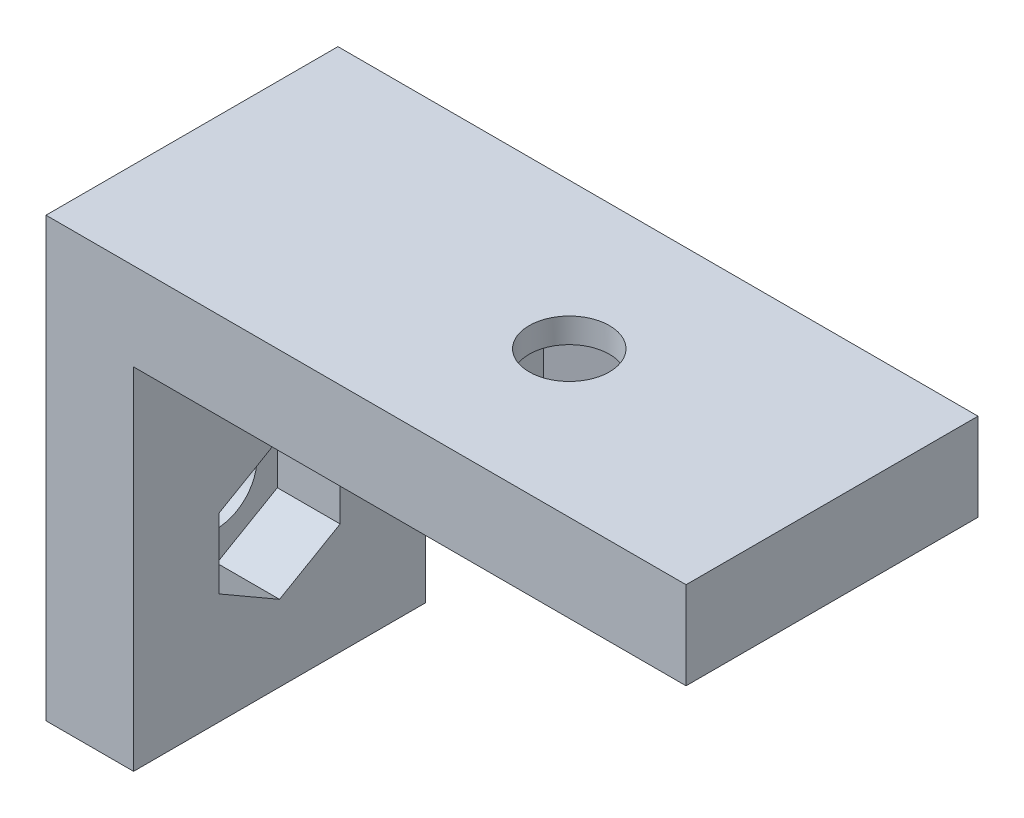
ISO-10303-21;
HEADER;
FILE_DESCRIPTION(('STEP AP214'),'2;1');
FILE_NAME('part.step','',(''),(''),'','','');
FILE_SCHEMA(('AUTOMOTIVE_DESIGN { 1 0 10303 214 1 1 1 1 }'));
ENDSEC;
DATA;
#1=APPLICATION_CONTEXT('core data for automotive mechanical design processes');
#2=APPLICATION_PROTOCOL_DEFINITION('international standard','automotive_design',2000,#1);
#3=PRODUCT_CONTEXT('',#1,'mechanical');
#4=PRODUCT('Part','Part','',(#3));
#5=PRODUCT_RELATED_PRODUCT_CATEGORY('part','',(#4));
#6=PRODUCT_DEFINITION_FORMATION('','',#4);
#7=PRODUCT_DEFINITION_CONTEXT('part definition',#1,'design');
#8=PRODUCT_DEFINITION('design','',#6,#7);
#9=PRODUCT_DEFINITION_SHAPE('','',#8);
#10=(LENGTH_UNIT() NAMED_UNIT(*) SI_UNIT(.MILLI.,.METRE.));
#11=(NAMED_UNIT(*) PLANE_ANGLE_UNIT() SI_UNIT($,.RADIAN.));
#12=(NAMED_UNIT(*) SI_UNIT($,.STERADIAN.) SOLID_ANGLE_UNIT());
#13=UNCERTAINTY_MEASURE_WITH_UNIT(LENGTH_MEASURE(1.E-05),#10,'distance_accuracy_value','');
#14=(GEOMETRIC_REPRESENTATION_CONTEXT(3) GLOBAL_UNCERTAINTY_ASSIGNED_CONTEXT((#13)) GLOBAL_UNIT_ASSIGNED_CONTEXT((#10,
#11,#12)) REPRESENTATION_CONTEXT('',''));
#15=CARTESIAN_POINT('',(0.,0.,0.));
#16=DIRECTION('',(0.,0.,1.));
#17=DIRECTION('',(1.,0.,0.));
#18=AXIS2_PLACEMENT_3D('',#15,#16,#17);
#19=CARTESIAN_POINT('',(6.15,-20.,10.));
#20=DIRECTION('',(-1.,0.,0.));
#21=DIRECTION('',(0.,0.,1.));
#22=AXIS2_PLACEMENT_3D('',#19,#20,#21);
#23=CYLINDRICAL_SURFACE('',#22,2.75);
#24=CARTESIAN_POINT('',(6.15,-20.,10.));
#25=DIRECTION('',(1.,0.,0.));
#26=DIRECTION('',(0.,0.,-1.));
#27=AXIS2_PLACEMENT_3D('',#24,#25,#26);
#28=CIRCLE('',#27,2.75);
#29=CARTESIAN_POINT('',(6.15,-20.,7.25));
#30=VERTEX_POINT('',#29);
#31=EDGE_CURVE('E222',#30,#30,#28,.F.);
#32=ORIENTED_EDGE('',*,*,#31,.T.);
#33=EDGE_LOOP('',(#32));
#34=FACE_BOUND('',#33,.T.);
#35=CARTESIAN_POINT('',(7.85,-20.,10.));
#36=DIRECTION('',(1.,0.,0.));
#37=DIRECTION('',(0.,0.,-1.));
#38=AXIS2_PLACEMENT_3D('',#35,#36,#37);
#39=CIRCLE('',#38,2.75);
#40=CARTESIAN_POINT('',(7.85,-20.,7.25));
#41=VERTEX_POINT('',#40);
#42=EDGE_CURVE('E45',#41,#41,#39,.T.);
#43=ORIENTED_EDGE('',*,*,#42,.T.);
#44=EDGE_LOOP('',(#43));
#45=FACE_BOUND('',#44,.T.);
#46=ADVANCED_FACE('F41',(#34,#45),#23,.F.);
#47=CARTESIAN_POINT('',(6.15,0.,20.));
#48=DIRECTION('',(1.,0.,0.));
#49=DIRECTION('',(0.,0.,-1.));
#50=AXIS2_PLACEMENT_3D('',#47,#48,#49);
#51=PLANE('',#50);
#52=ORIENTED_EDGE('',*,*,#31,.F.);
#53=EDGE_LOOP('',(#52));
#54=FACE_BOUND('',#53,.T.);
#55=DIRECTION('',(0.,-1.,0.));
#56=VECTOR('',#55,1.);
#57=CARTESIAN_POINT('',(6.15,0.,0.));
#58=LINE('',#57,#56);
#59=CARTESIAN_POINT('',(6.15,0.,0.));
#60=VERTEX_POINT('',#59);
#61=CARTESIAN_POINT('',(6.15,-30.,0.));
#62=VERTEX_POINT('',#61);
#63=EDGE_CURVE('E287',#60,#62,#58,.T.);
#64=ORIENTED_EDGE('',*,*,#63,.T.);
#65=DIRECTION('',(0.,0.,-1.));
#66=VECTOR('',#65,1.);
#67=CARTESIAN_POINT('',(6.15,-30.,20.));
#68=LINE('',#67,#66);
#69=CARTESIAN_POINT('',(6.15,-30.,20.));
#70=VERTEX_POINT('',#69);
#71=EDGE_CURVE('E11',#70,#62,#68,.T.);
#72=ORIENTED_EDGE('',*,*,#71,.F.);
#73=DIRECTION('',(0.,-1.,0.));
#74=VECTOR('',#73,1.);
#75=CARTESIAN_POINT('',(6.15,0.,20.));
#76=LINE('',#75,#74);
#77=CARTESIAN_POINT('',(6.15,0.,20.));
#78=VERTEX_POINT('',#77);
#79=EDGE_CURVE('E272',#78,#70,#76,.T.);
#80=ORIENTED_EDGE('',*,*,#79,.F.);
#81=DIRECTION('',(0.,0.,-1.));
#82=VECTOR('',#81,1.);
#83=CARTESIAN_POINT('',(6.15,0.,20.));
#84=LINE('',#83,#82);
#85=EDGE_CURVE('E286',#78,#60,#84,.T.);
#86=ORIENTED_EDGE('',*,*,#85,.T.);
#87=EDGE_LOOP('',(#64,#72,#80,#86));
#88=FACE_BOUND('',#87,.T.);
#89=ADVANCED_FACE('F43',(#54,#88),#51,.F.);
#90=CARTESIAN_POINT('',(6.15,-30.,20.));
#91=DIRECTION('',(0.,1.,0.));
#92=DIRECTION('',(0.,0.,1.));
#93=AXIS2_PLACEMENT_3D('',#90,#91,#92);
#94=PLANE('',#93);
#95=DIRECTION('',(1.,0.,0.));
#96=VECTOR('',#95,1.);
#97=CARTESIAN_POINT('',(6.15,-30.,0.));
#98=LINE('',#97,#96);
#99=CARTESIAN_POINT('',(12.15,-30.,0.));
#100=VERTEX_POINT('',#99);
#101=EDGE_CURVE('E290',#62,#100,#98,.T.);
#102=ORIENTED_EDGE('',*,*,#101,.T.);
#103=DIRECTION('',(0.,0.,-1.));
#104=VECTOR('',#103,1.);
#105=CARTESIAN_POINT('',(12.15,-30.,20.));
#106=LINE('',#105,#104);
#107=CARTESIAN_POINT('',(12.15,-30.,20.));
#108=VERTEX_POINT('',#107);
#109=EDGE_CURVE('E50',#108,#100,#106,.T.);
#110=ORIENTED_EDGE('',*,*,#109,.F.);
#111=DIRECTION('',(1.,0.,0.));
#112=VECTOR('',#111,1.);
#113=CARTESIAN_POINT('',(6.15,-30.,20.));
#114=LINE('',#113,#112);
#115=EDGE_CURVE('E275',#70,#108,#114,.T.);
#116=ORIENTED_EDGE('',*,*,#115,.F.);
#117=ORIENTED_EDGE('',*,*,#71,.T.);
#118=EDGE_LOOP('',(#102,#110,#116,#117));
#119=FACE_BOUND('',#118,.T.);
#120=ADVANCED_FACE('F341',(#119),#94,.F.);
#121=CARTESIAN_POINT('',(12.15,-30.,20.));
#122=DIRECTION('',(-1.,0.,0.));
#123=DIRECTION('',(0.,0.,1.));
#124=AXIS2_PLACEMENT_3D('',#121,#122,#123);
#125=PLANE('',#124);
#126=DIRECTION('',(0.,-0.5,0.866025403784438));
#127=VECTOR('',#126,1.);
#128=CARTESIAN_POINT('',(12.15,-15.2079927657261,10.));
#129=LINE('',#128,#127);
#130=CARTESIAN_POINT('',(12.15,-15.2079927657261,10.));
#131=VERTEX_POINT('',#130);
#132=CARTESIAN_POINT('',(12.15,-17.6039963828631,14.15));
#133=VERTEX_POINT('',#132);
#134=EDGE_CURVE('E203',#131,#133,#129,.T.);
#135=ORIENTED_EDGE('',*,*,#134,.F.);
#136=DIRECTION('',(0.,0.5,0.866025403784438));
#137=VECTOR('',#136,1.);
#138=CARTESIAN_POINT('',(12.15,-17.6039963828631,5.85));
#139=LINE('',#138,#137);
#140=CARTESIAN_POINT('',(12.15,-17.6039963828631,5.85));
#141=VERTEX_POINT('',#140);
#142=EDGE_CURVE('E58',#141,#131,#139,.T.);
#143=ORIENTED_EDGE('',*,*,#142,.F.);
#144=DIRECTION('',(0.,1.,0.));
#145=VECTOR('',#144,1.);
#146=CARTESIAN_POINT('',(12.15,-22.396003617137,5.85));
#147=LINE('',#146,#145);
#148=CARTESIAN_POINT('',(12.15,-22.396003617137,5.85));
#149=VERTEX_POINT('',#148);
#150=EDGE_CURVE('E189',#149,#141,#147,.T.);
#151=ORIENTED_EDGE('',*,*,#150,.F.);
#152=DIRECTION('',(0.,0.5,-0.866025403784439));
#153=VECTOR('',#152,1.);
#154=CARTESIAN_POINT('',(12.15,-24.7920072342739,10.));
#155=LINE('',#154,#153);
#156=CARTESIAN_POINT('',(12.15,-24.7920072342739,10.));
#157=VERTEX_POINT('',#156);
#158=EDGE_CURVE('E192',#157,#149,#155,.T.);
#159=ORIENTED_EDGE('',*,*,#158,.F.);
#160=DIRECTION('',(0.,-0.5,-0.866025403784438));
#161=VECTOR('',#160,1.);
#162=CARTESIAN_POINT('',(12.15,-22.3960036171369,14.15));
#163=LINE('',#162,#161);
#164=CARTESIAN_POINT('',(12.15,-22.3960036171369,14.15));
#165=VERTEX_POINT('',#164);
#166=EDGE_CURVE('E208',#165,#157,#163,.T.);
#167=ORIENTED_EDGE('',*,*,#166,.F.);
#168=DIRECTION('',(0.,-1.,0.));
#169=VECTOR('',#168,1.);
#170=CARTESIAN_POINT('',(12.15,-17.6039963828631,14.15));
#171=LINE('',#170,#169);
#172=EDGE_CURVE('E205',#133,#165,#171,.T.);
#173=ORIENTED_EDGE('',*,*,#172,.F.);
#174=EDGE_LOOP('',(#135,#143,#151,#159,#167,#173));
#175=FACE_BOUND('',#174,.T.);
#176=DIRECTION('',(0.,1.,0.));
#177=VECTOR('',#176,1.);
#178=CARTESIAN_POINT('',(12.15,-30.,0.));
#179=LINE('',#178,#177);
#180=CARTESIAN_POINT('',(12.15,-6.,0.));
#181=VERTEX_POINT('',#180);
#182=EDGE_CURVE('E293',#100,#181,#179,.T.);
#183=ORIENTED_EDGE('',*,*,#182,.T.);
#184=DIRECTION('',(0.,0.,-1.));
#185=VECTOR('',#184,1.);
#186=CARTESIAN_POINT('',(12.15,-6.,20.));
#187=LINE('',#186,#185);
#188=CARTESIAN_POINT('',(12.15,-6.,20.));
#189=VERTEX_POINT('',#188);
#190=EDGE_CURVE('E308',#189,#181,#187,.T.);
#191=ORIENTED_EDGE('',*,*,#190,.F.);
#192=DIRECTION('',(0.,1.,0.));
#193=VECTOR('',#192,1.);
#194=CARTESIAN_POINT('',(12.15,-30.,20.));
#195=LINE('',#194,#193);
#196=EDGE_CURVE('E278',#108,#189,#195,.T.);
#197=ORIENTED_EDGE('',*,*,#196,.F.);
#198=ORIENTED_EDGE('',*,*,#109,.T.);
#199=EDGE_LOOP('',(#183,#191,#197,#198));
#200=FACE_BOUND('',#199,.T.);
#201=ADVANCED_FACE('F406',(#175,#200),#125,.F.);
#202=CARTESIAN_POINT('',(12.15,-6.,20.));
#203=DIRECTION('',(0.,1.,0.));
#204=DIRECTION('',(0.,0.,1.));
#205=AXIS2_PLACEMENT_3D('',#202,#203,#204);
#206=PLANE('',#205);
#207=DIRECTION('',(0.,0.,-1.));
#208=VECTOR('',#207,1.);
#209=CARTESIAN_POINT('',(27.85,-6.,7.60399638286305));
#210=LINE('',#209,#208);
#211=CARTESIAN_POINT('',(27.85,-6.,12.3960036171369));
#212=VERTEX_POINT('',#211);
#213=CARTESIAN_POINT('',(27.85,-6.,7.60399638286305));
#214=VERTEX_POINT('',#213);
#215=EDGE_CURVE('E246',#212,#214,#210,.T.);
#216=ORIENTED_EDGE('',*,*,#215,.F.);
#217=DIRECTION('',(-0.866025403784439,0.,-0.5));
#218=VECTOR('',#217,1.);
#219=CARTESIAN_POINT('',(27.85,-6.,12.3960036171369));
#220=LINE('',#219,#218);
#221=CARTESIAN_POINT('',(32.,-6.,14.7920072342739));
#222=VERTEX_POINT('',#221);
#223=EDGE_CURVE('E66',#222,#212,#220,.T.);
#224=ORIENTED_EDGE('',*,*,#223,.F.);
#225=DIRECTION('',(-0.866025403784439,0.,0.5));
#226=VECTOR('',#225,1.);
#227=CARTESIAN_POINT('',(32.,-6.,14.7920072342739));
#228=LINE('',#227,#226);
#229=CARTESIAN_POINT('',(36.15,-6.,12.3960036171369));
#230=VERTEX_POINT('',#229);
#231=EDGE_CURVE('E229',#230,#222,#228,.T.);
#232=ORIENTED_EDGE('',*,*,#231,.F.);
#233=DIRECTION('',(0.,0.,1.));
#234=VECTOR('',#233,1.);
#235=CARTESIAN_POINT('',(36.15,-6.,12.3960036171369));
#236=LINE('',#235,#234);
#237=CARTESIAN_POINT('',(36.15,-6.,7.60399638286305));
#238=VERTEX_POINT('',#237);
#239=EDGE_CURVE('E255',#238,#230,#236,.T.);
#240=ORIENTED_EDGE('',*,*,#239,.F.);
#241=DIRECTION('',(0.866025403784439,0.,0.5));
#242=VECTOR('',#241,1.);
#243=CARTESIAN_POINT('',(36.15,-6.,7.60399638286305));
#244=LINE('',#243,#242);
#245=CARTESIAN_POINT('',(32.,-6.,5.20799276572611));
#246=VERTEX_POINT('',#245);
#247=EDGE_CURVE('E252',#246,#238,#244,.T.);
#248=ORIENTED_EDGE('',*,*,#247,.F.);
#249=DIRECTION('',(0.866025403784439,0.,-0.5));
#250=VECTOR('',#249,1.);
#251=CARTESIAN_POINT('',(32.,-6.,5.20799276572611));
#252=LINE('',#251,#250);
#253=EDGE_CURVE('E249',#214,#246,#252,.T.);
#254=ORIENTED_EDGE('',*,*,#253,.F.);
#255=EDGE_LOOP('',(#216,#224,#232,#240,#248,#254));
#256=FACE_BOUND('',#255,.T.);
#257=DIRECTION('',(1.,0.,0.));
#258=VECTOR('',#257,1.);
#259=CARTESIAN_POINT('',(12.15,-6.,0.));
#260=LINE('',#259,#258);
#261=CARTESIAN_POINT('',(50.,-6.,0.));
#262=VERTEX_POINT('',#261);
#263=EDGE_CURVE('E295',#181,#262,#260,.T.);
#264=ORIENTED_EDGE('',*,*,#263,.T.);
#265=DIRECTION('',(0.,0.,-1.));
#266=VECTOR('',#265,1.);
#267=CARTESIAN_POINT('',(50.,-6.,20.));
#268=LINE('',#267,#266);
#269=CARTESIAN_POINT('',(50.,-6.,20.));
#270=VERTEX_POINT('',#269);
#271=EDGE_CURVE('E305',#270,#262,#268,.T.);
#272=ORIENTED_EDGE('',*,*,#271,.F.);
#273=DIRECTION('',(1.,0.,0.));
#274=VECTOR('',#273,1.);
#275=CARTESIAN_POINT('',(12.15,-6.,20.));
#276=LINE('',#275,#274);
#277=EDGE_CURVE('E280',#189,#270,#276,.T.);
#278=ORIENTED_EDGE('',*,*,#277,.F.);
#279=ORIENTED_EDGE('',*,*,#190,.T.);
#280=EDGE_LOOP('',(#264,#272,#278,#279));
#281=FACE_BOUND('',#280,.T.);
#282=ADVANCED_FACE('F409',(#256,#281),#206,.F.);
#283=CARTESIAN_POINT('',(50.,-6.,20.));
#284=DIRECTION('',(-1.,0.,0.));
#285=DIRECTION('',(0.,0.,1.));
#286=AXIS2_PLACEMENT_3D('',#283,#284,#285);
#287=PLANE('',#286);
#288=DIRECTION('',(0.,1.,0.));
#289=VECTOR('',#288,1.);
#290=CARTESIAN_POINT('',(50.,-6.,0.));
#291=LINE('',#290,#289);
#292=CARTESIAN_POINT('',(50.,0.,0.));
#293=VERTEX_POINT('',#292);
#294=EDGE_CURVE('E297',#262,#293,#291,.T.);
#295=ORIENTED_EDGE('',*,*,#294,.T.);
#296=DIRECTION('',(0.,0.,-1.));
#297=VECTOR('',#296,1.);
#298=CARTESIAN_POINT('',(50.,0.,20.));
#299=LINE('',#298,#297);
#300=CARTESIAN_POINT('',(50.,0.,20.));
#301=VERTEX_POINT('',#300);
#302=EDGE_CURVE('E302',#301,#293,#299,.T.);
#303=ORIENTED_EDGE('',*,*,#302,.F.);
#304=DIRECTION('',(0.,1.,0.));
#305=VECTOR('',#304,1.);
#306=CARTESIAN_POINT('',(50.,-6.,20.));
#307=LINE('',#306,#305);
#308=EDGE_CURVE('E282',#270,#301,#307,.T.);
#309=ORIENTED_EDGE('',*,*,#308,.F.);
#310=ORIENTED_EDGE('',*,*,#271,.T.);
#311=EDGE_LOOP('',(#295,#303,#309,#310));
#312=FACE_BOUND('',#311,.T.);
#313=ADVANCED_FACE('F428',(#312),#287,.F.);
#314=CARTESIAN_POINT('',(50.,0.,20.));
#315=DIRECTION('',(0.,-1.,0.));
#316=DIRECTION('',(0.,0.,-1.));
#317=AXIS2_PLACEMENT_3D('',#314,#315,#316);
#318=PLANE('',#317);
#319=CARTESIAN_POINT('',(32.,0.,10.));
#320=DIRECTION('',(0.,-1.,0.));
#321=DIRECTION('',(0.,0.,-1.));
#322=AXIS2_PLACEMENT_3D('',#319,#320,#321);
#323=CIRCLE('',#322,2.75);
#324=CARTESIAN_POINT('',(32.,0.,7.25));
#325=VERTEX_POINT('',#324);
#326=EDGE_CURVE('E291',#325,#325,#323,.T.);
#327=ORIENTED_EDGE('',*,*,#326,.T.);
#328=EDGE_LOOP('',(#327));
#329=FACE_BOUND('',#328,.T.);
#330=DIRECTION('',(-1.,0.,0.));
#331=VECTOR('',#330,1.);
#332=CARTESIAN_POINT('',(50.,0.,0.));
#333=LINE('',#332,#331);
#334=EDGE_CURVE('E276',#293,#60,#333,.T.);
#335=ORIENTED_EDGE('',*,*,#334,.T.);
#336=ORIENTED_EDGE('',*,*,#85,.F.);
#337=DIRECTION('',(-1.,0.,0.));
#338=VECTOR('',#337,1.);
#339=CARTESIAN_POINT('',(50.,0.,20.));
#340=LINE('',#339,#338);
#341=EDGE_CURVE('E284',#301,#78,#340,.T.);
#342=ORIENTED_EDGE('',*,*,#341,.F.);
#343=ORIENTED_EDGE('',*,*,#302,.T.);
#344=EDGE_LOOP('',(#335,#336,#342,#343));
#345=FACE_BOUND('',#344,.T.);
#346=ADVANCED_FACE('F439',(#329,#345),#318,.F.);
#347=CARTESIAN_POINT('',(0.,0.,20.));
#348=DIRECTION('',(0.,0.,1.));
#349=DIRECTION('',(1.,0.,0.));
#350=AXIS2_PLACEMENT_3D('',#347,#348,#349);
#351=PLANE('',#350);
#352=ORIENTED_EDGE('',*,*,#79,.T.);
#353=ORIENTED_EDGE('',*,*,#115,.T.);
#354=ORIENTED_EDGE('',*,*,#196,.T.);
#355=ORIENTED_EDGE('',*,*,#277,.T.);
#356=ORIENTED_EDGE('',*,*,#308,.T.);
#357=ORIENTED_EDGE('',*,*,#341,.T.);
#358=EDGE_LOOP('',(#352,#353,#354,#355,#356,#357));
#359=FACE_BOUND('',#358,.T.);
#360=ADVANCED_FACE('F449',(#359),#351,.T.);
#361=CARTESIAN_POINT('',(0.,0.,0.));
#362=DIRECTION('',(0.,0.,1.));
#363=DIRECTION('',(1.,0.,0.));
#364=AXIS2_PLACEMENT_3D('',#361,#362,#363);
#365=PLANE('',#364);
#366=ORIENTED_EDGE('',*,*,#63,.F.);
#367=ORIENTED_EDGE('',*,*,#334,.F.);
#368=ORIENTED_EDGE('',*,*,#294,.F.);
#369=ORIENTED_EDGE('',*,*,#263,.F.);
#370=ORIENTED_EDGE('',*,*,#182,.F.);
#371=ORIENTED_EDGE('',*,*,#101,.F.);
#372=EDGE_LOOP('',(#366,#367,#368,#369,#370,#371));
#373=FACE_BOUND('',#372,.T.);
#374=ADVANCED_FACE('F331',(#373),#365,.F.);
#375=CARTESIAN_POINT('',(32.,-30.,10.));
#376=DIRECTION('',(0.,1.,0.));
#377=DIRECTION('',(0.,0.,1.));
#378=AXIS2_PLACEMENT_3D('',#375,#376,#377);
#379=CYLINDRICAL_SURFACE('',#378,2.75);
#380=CARTESIAN_POINT('',(32.,-1.7,10.));
#381=DIRECTION('',(0.,1.,0.));
#382=DIRECTION('',(0.,0.,1.));
#383=AXIS2_PLACEMENT_3D('',#380,#381,#382);
#384=CIRCLE('',#383,2.75);
#385=CARTESIAN_POINT('',(32.,-1.7,12.75));
#386=VERTEX_POINT('',#385);
#387=EDGE_CURVE('E262',#386,#386,#384,.F.);
#388=ORIENTED_EDGE('',*,*,#387,.T.);
#389=EDGE_LOOP('',(#388));
#390=FACE_BOUND('',#389,.T.);
#391=ORIENTED_EDGE('',*,*,#326,.F.);
#392=EDGE_LOOP('',(#391));
#393=FACE_BOUND('',#392,.T.);
#394=ADVANCED_FACE('F317',(#390,#393),#379,.F.);
#395=CARTESIAN_POINT('',(0.,-1.7,0.));
#396=DIRECTION('',(0.,1.,0.));
#397=DIRECTION('',(0.,0.,1.));
#398=AXIS2_PLACEMENT_3D('',#395,#396,#397);
#399=PLANE('',#398);
#400=DIRECTION('',(-0.866025403784439,0.,-0.5));
#401=VECTOR('',#400,1.);
#402=CARTESIAN_POINT('',(27.85,-1.7,12.3960036171369));
#403=LINE('',#402,#401);
#404=CARTESIAN_POINT('',(32.,-1.7,14.7920072342739));
#405=VERTEX_POINT('',#404);
#406=CARTESIAN_POINT('',(27.85,-1.7,12.3960036171369));
#407=VERTEX_POINT('',#406);
#408=EDGE_CURVE('E225',#405,#407,#403,.T.);
#409=ORIENTED_EDGE('',*,*,#408,.T.);
#410=DIRECTION('',(0.,0.,-1.));
#411=VECTOR('',#410,1.);
#412=CARTESIAN_POINT('',(27.85,-1.7,7.60399638286305));
#413=LINE('',#412,#411);
#414=CARTESIAN_POINT('',(27.85,-1.7,7.60399638286305));
#415=VERTEX_POINT('',#414);
#416=EDGE_CURVE('E228',#407,#415,#413,.T.);
#417=ORIENTED_EDGE('',*,*,#416,.T.);
#418=DIRECTION('',(0.866025403784439,0.,-0.5));
#419=VECTOR('',#418,1.);
#420=CARTESIAN_POINT('',(32.,-1.7,5.20799276572611));
#421=LINE('',#420,#419);
#422=CARTESIAN_POINT('',(32.,-1.7,5.20799276572611));
#423=VERTEX_POINT('',#422);
#424=EDGE_CURVE('E232',#415,#423,#421,.T.);
#425=ORIENTED_EDGE('',*,*,#424,.T.);
#426=DIRECTION('',(0.866025403784439,0.,0.5));
#427=VECTOR('',#426,1.);
#428=CARTESIAN_POINT('',(36.15,-1.7,7.60399638286305));
#429=LINE('',#428,#427);
#430=CARTESIAN_POINT('',(36.15,-1.7,7.60399638286305));
#431=VERTEX_POINT('',#430);
#432=EDGE_CURVE('E235',#423,#431,#429,.T.);
#433=ORIENTED_EDGE('',*,*,#432,.T.);
#434=DIRECTION('',(0.,0.,1.));
#435=VECTOR('',#434,1.);
#436=CARTESIAN_POINT('',(36.15,-1.7,12.3960036171369));
#437=LINE('',#436,#435);
#438=CARTESIAN_POINT('',(36.15,-1.7,12.3960036171369));
#439=VERTEX_POINT('',#438);
#440=EDGE_CURVE('E238',#431,#439,#437,.T.);
#441=ORIENTED_EDGE('',*,*,#440,.T.);
#442=DIRECTION('',(-0.866025403784439,0.,0.5));
#443=VECTOR('',#442,1.);
#444=CARTESIAN_POINT('',(32.,-1.7,14.7920072342739));
#445=LINE('',#444,#443);
#446=EDGE_CURVE('E241',#439,#405,#445,.T.);
#447=ORIENTED_EDGE('',*,*,#446,.T.);
#448=EDGE_LOOP('',(#409,#417,#425,#433,#441,#447));
#449=FACE_BOUND('',#448,.T.);
#450=ORIENTED_EDGE('',*,*,#387,.F.);
#451=EDGE_LOOP('',(#450));
#452=FACE_BOUND('',#451,.T.);
#453=ADVANCED_FACE('F320',(#449,#452),#399,.F.);
#454=CARTESIAN_POINT('',(27.85,-1.7,12.3960036171369));
#455=DIRECTION('',(-0.5,0.,0.866025403784439));
#456=DIRECTION('',(0.866025403784439,0.,0.5));
#457=AXIS2_PLACEMENT_3D('',#454,#455,#456);
#458=PLANE('',#457);
#459=ORIENTED_EDGE('',*,*,#223,.T.);
#460=DIRECTION('',(0.,-1.,0.));
#461=VECTOR('',#460,1.);
#462=CARTESIAN_POINT('',(27.85,-1.7,12.3960036171369));
#463=LINE('',#462,#461);
#464=EDGE_CURVE('E244',#407,#212,#463,.T.);
#465=ORIENTED_EDGE('',*,*,#464,.F.);
#466=ORIENTED_EDGE('',*,*,#408,.F.);
#467=DIRECTION('',(0.,-1.,0.));
#468=VECTOR('',#467,1.);
#469=CARTESIAN_POINT('',(32.,-1.7,14.7920072342739));
#470=LINE('',#469,#468);
#471=EDGE_CURVE('E260',#405,#222,#470,.T.);
#472=ORIENTED_EDGE('',*,*,#471,.T.);
#473=EDGE_LOOP('',(#459,#465,#466,#472));
#474=FACE_BOUND('',#473,.T.);
#475=ADVANCED_FACE('F322',(#474),#458,.F.);
#476=CARTESIAN_POINT('',(32.,-1.7,14.7920072342739));
#477=DIRECTION('',(0.5,0.,0.866025403784439));
#478=DIRECTION('',(0.866025403784439,0.,-0.5));
#479=AXIS2_PLACEMENT_3D('',#476,#477,#478);
#480=PLANE('',#479);
#481=ORIENTED_EDGE('',*,*,#231,.T.);
#482=ORIENTED_EDGE('',*,*,#471,.F.);
#483=ORIENTED_EDGE('',*,*,#446,.F.);
#484=DIRECTION('',(0.,-1.,0.));
#485=VECTOR('',#484,1.);
#486=CARTESIAN_POINT('',(36.15,-1.7,12.3960036171369));
#487=LINE('',#486,#485);
#488=EDGE_CURVE('E263',#439,#230,#487,.T.);
#489=ORIENTED_EDGE('',*,*,#488,.T.);
#490=EDGE_LOOP('',(#481,#482,#483,#489));
#491=FACE_BOUND('',#490,.T.);
#492=ADVANCED_FACE('F329',(#491),#480,.F.);
#493=CARTESIAN_POINT('',(36.15,-1.7,12.3960036171369));
#494=DIRECTION('',(1.,0.,0.));
#495=DIRECTION('',(0.,0.,-1.));
#496=AXIS2_PLACEMENT_3D('',#493,#494,#495);
#497=PLANE('',#496);
#498=ORIENTED_EDGE('',*,*,#239,.T.);
#499=ORIENTED_EDGE('',*,*,#488,.F.);
#500=ORIENTED_EDGE('',*,*,#440,.F.);
#501=DIRECTION('',(0.,-1.,0.));
#502=VECTOR('',#501,1.);
#503=CARTESIAN_POINT('',(36.15,-1.7,7.60399638286305));
#504=LINE('',#503,#502);
#505=EDGE_CURVE('E265',#431,#238,#504,.T.);
#506=ORIENTED_EDGE('',*,*,#505,.T.);
#507=EDGE_LOOP('',(#498,#499,#500,#506));
#508=FACE_BOUND('',#507,.T.);
#509=ADVANCED_FACE('F492',(#508),#497,.F.);
#510=CARTESIAN_POINT('',(36.15,-1.7,7.60399638286305));
#511=DIRECTION('',(0.5,0.,-0.866025403784439));
#512=DIRECTION('',(-0.866025403784439,0.,-0.5));
#513=AXIS2_PLACEMENT_3D('',#510,#511,#512);
#514=PLANE('',#513);
#515=ORIENTED_EDGE('',*,*,#247,.T.);
#516=ORIENTED_EDGE('',*,*,#505,.F.);
#517=ORIENTED_EDGE('',*,*,#432,.F.);
#518=DIRECTION('',(0.,-1.,0.));
#519=VECTOR('',#518,1.);
#520=CARTESIAN_POINT('',(32.,-1.7,5.20799276572611));
#521=LINE('',#520,#519);
#522=EDGE_CURVE('E267',#423,#246,#521,.T.);
#523=ORIENTED_EDGE('',*,*,#522,.T.);
#524=EDGE_LOOP('',(#515,#516,#517,#523));
#525=FACE_BOUND('',#524,.T.);
#526=ADVANCED_FACE('F501',(#525),#514,.F.);
#527=CARTESIAN_POINT('',(32.,-1.7,5.20799276572611));
#528=DIRECTION('',(-0.5,0.,-0.866025403784439));
#529=DIRECTION('',(-0.866025403784439,0.,0.5));
#530=AXIS2_PLACEMENT_3D('',#527,#528,#529);
#531=PLANE('',#530);
#532=ORIENTED_EDGE('',*,*,#253,.T.);
#533=ORIENTED_EDGE('',*,*,#522,.F.);
#534=ORIENTED_EDGE('',*,*,#424,.F.);
#535=DIRECTION('',(0.,-1.,0.));
#536=VECTOR('',#535,1.);
#537=CARTESIAN_POINT('',(27.85,-1.7,7.60399638286305));
#538=LINE('',#537,#536);
#539=EDGE_CURVE('E269',#415,#214,#538,.T.);
#540=ORIENTED_EDGE('',*,*,#539,.T.);
#541=EDGE_LOOP('',(#532,#533,#534,#540));
#542=FACE_BOUND('',#541,.T.);
#543=ADVANCED_FACE('F511',(#542),#531,.F.);
#544=CARTESIAN_POINT('',(27.85,-1.7,7.60399638286305));
#545=DIRECTION('',(-1.,0.,0.));
#546=DIRECTION('',(0.,0.,1.));
#547=AXIS2_PLACEMENT_3D('',#544,#545,#546);
#548=PLANE('',#547);
#549=ORIENTED_EDGE('',*,*,#215,.T.);
#550=ORIENTED_EDGE('',*,*,#539,.F.);
#551=ORIENTED_EDGE('',*,*,#416,.F.);
#552=ORIENTED_EDGE('',*,*,#464,.T.);
#553=EDGE_LOOP('',(#549,#550,#551,#552));
#554=FACE_BOUND('',#553,.T.);
#555=ADVANCED_FACE('F348',(#554),#548,.F.);
#556=CARTESIAN_POINT('',(7.85,-17.6039963828631,5.85));
#557=DIRECTION('',(0.,0.866025403784439,-0.5));
#558=DIRECTION('',(0.,0.5,0.866025403784439));
#559=AXIS2_PLACEMENT_3D('',#556,#557,#558);
#560=PLANE('',#559);
#561=ORIENTED_EDGE('',*,*,#142,.T.);
#562=DIRECTION('',(1.,0.,0.));
#563=VECTOR('',#562,1.);
#564=CARTESIAN_POINT('',(7.85,-15.2079927657261,10.));
#565=LINE('',#564,#563);
#566=CARTESIAN_POINT('',(7.85,-15.2079927657261,10.));
#567=VERTEX_POINT('',#566);
#568=EDGE_CURVE('E166',#567,#131,#565,.T.);
#569=ORIENTED_EDGE('',*,*,#568,.F.);
#570=DIRECTION('',(0.,0.5,0.866025403784438));
#571=VECTOR('',#570,1.);
#572=CARTESIAN_POINT('',(7.85,-17.6039963828631,5.85));
#573=LINE('',#572,#571);
#574=CARTESIAN_POINT('',(7.85,-17.6039963828631,5.85));
#575=VERTEX_POINT('',#574);
#576=EDGE_CURVE('E170',#575,#567,#573,.T.);
#577=ORIENTED_EDGE('',*,*,#576,.F.);
#578=DIRECTION('',(1.,0.,0.));
#579=VECTOR('',#578,1.);
#580=CARTESIAN_POINT('',(7.85,-17.6039963828631,5.85));
#581=LINE('',#580,#579);
#582=EDGE_CURVE('E213',#575,#141,#581,.T.);
#583=ORIENTED_EDGE('',*,*,#582,.T.);
#584=EDGE_LOOP('',(#561,#569,#577,#583));
#585=FACE_BOUND('',#584,.T.);
#586=ADVANCED_FACE('F168',(#585),#560,.F.);
#587=CARTESIAN_POINT('',(7.85,-22.396003617137,5.85));
#588=DIRECTION('',(0.,0.,-1.));
#589=DIRECTION('',(0.,1.,0.));
#590=AXIS2_PLACEMENT_3D('',#587,#588,#589);
#591=PLANE('',#590);
#592=ORIENTED_EDGE('',*,*,#150,.T.);
#593=ORIENTED_EDGE('',*,*,#582,.F.);
#594=DIRECTION('',(0.,1.,0.));
#595=VECTOR('',#594,1.);
#596=CARTESIAN_POINT('',(7.85,-22.396003617137,5.85));
#597=LINE('',#596,#595);
#598=CARTESIAN_POINT('',(7.85,-22.396003617137,5.85));
#599=VERTEX_POINT('',#598);
#600=EDGE_CURVE('E176',#599,#575,#597,.T.);
#601=ORIENTED_EDGE('',*,*,#600,.F.);
#602=DIRECTION('',(1.,0.,0.));
#603=VECTOR('',#602,1.);
#604=CARTESIAN_POINT('',(7.85,-22.396003617137,5.85));
#605=LINE('',#604,#603);
#606=EDGE_CURVE('E215',#599,#149,#605,.T.);
#607=ORIENTED_EDGE('',*,*,#606,.T.);
#608=EDGE_LOOP('',(#592,#593,#601,#607));
#609=FACE_BOUND('',#608,.T.);
#610=ADVANCED_FACE('F347',(#609),#591,.F.);
#611=CARTESIAN_POINT('',(7.85,-24.7920072342739,10.));
#612=DIRECTION('',(0.,-0.866025403784439,-0.5));
#613=DIRECTION('',(0.,0.5,-0.866025403784439));
#614=AXIS2_PLACEMENT_3D('',#611,#612,#613);
#615=PLANE('',#614);
#616=ORIENTED_EDGE('',*,*,#158,.T.);
#617=ORIENTED_EDGE('',*,*,#606,.F.);
#618=DIRECTION('',(0.,0.5,-0.866025403784439));
#619=VECTOR('',#618,1.);
#620=CARTESIAN_POINT('',(7.85,-24.7920072342739,10.));
#621=LINE('',#620,#619);
#622=CARTESIAN_POINT('',(7.85,-24.7920072342739,10.));
#623=VERTEX_POINT('',#622);
#624=EDGE_CURVE('E199',#623,#599,#621,.T.);
#625=ORIENTED_EDGE('',*,*,#624,.F.);
#626=DIRECTION('',(1.,0.,0.));
#627=VECTOR('',#626,1.);
#628=CARTESIAN_POINT('',(7.85,-24.7920072342739,10.));
#629=LINE('',#628,#627);
#630=EDGE_CURVE('E217',#623,#157,#629,.T.);
#631=ORIENTED_EDGE('',*,*,#630,.T.);
#632=EDGE_LOOP('',(#616,#617,#625,#631));
#633=FACE_BOUND('',#632,.T.);
#634=ADVANCED_FACE('F358',(#633),#615,.F.);
#635=CARTESIAN_POINT('',(7.85,-22.3960036171369,14.15));
#636=DIRECTION('',(0.,-0.866025403784438,0.5));
#637=DIRECTION('',(0.,-0.5,-0.866025403784438));
#638=AXIS2_PLACEMENT_3D('',#635,#636,#637);
#639=PLANE('',#638);
#640=ORIENTED_EDGE('',*,*,#166,.T.);
#641=ORIENTED_EDGE('',*,*,#630,.F.);
#642=DIRECTION('',(0.,-0.5,-0.866025403784438));
#643=VECTOR('',#642,1.);
#644=CARTESIAN_POINT('',(7.85,-22.3960036171369,14.15));
#645=LINE('',#644,#643);
#646=CARTESIAN_POINT('',(7.85,-22.3960036171369,14.15));
#647=VERTEX_POINT('',#646);
#648=EDGE_CURVE('E196',#647,#623,#645,.T.);
#649=ORIENTED_EDGE('',*,*,#648,.F.);
#650=DIRECTION('',(1.,0.,0.));
#651=VECTOR('',#650,1.);
#652=CARTESIAN_POINT('',(7.85,-22.3960036171369,14.15));
#653=LINE('',#652,#651);
#654=EDGE_CURVE('E219',#647,#165,#653,.T.);
#655=ORIENTED_EDGE('',*,*,#654,.T.);
#656=EDGE_LOOP('',(#640,#641,#649,#655));
#657=FACE_BOUND('',#656,.T.);
#658=ADVANCED_FACE('F354',(#657),#639,.F.);
#659=CARTESIAN_POINT('',(7.85,-17.6039963828631,14.15));
#660=DIRECTION('',(0.,0.,1.));
#661=DIRECTION('',(0.,-1.,0.));
#662=AXIS2_PLACEMENT_3D('',#659,#660,#661);
#663=PLANE('',#662);
#664=ORIENTED_EDGE('',*,*,#172,.T.);
#665=ORIENTED_EDGE('',*,*,#654,.F.);
#666=DIRECTION('',(0.,-1.,0.));
#667=VECTOR('',#666,1.);
#668=CARTESIAN_POINT('',(7.85,-17.6039963828631,14.15));
#669=LINE('',#668,#667);
#670=CARTESIAN_POINT('',(7.85,-17.6039963828631,14.15));
#671=VERTEX_POINT('',#670);
#672=EDGE_CURVE('E184',#671,#647,#669,.T.);
#673=ORIENTED_EDGE('',*,*,#672,.F.);
#674=DIRECTION('',(1.,0.,0.));
#675=VECTOR('',#674,1.);
#676=CARTESIAN_POINT('',(7.85,-17.6039963828631,14.15));
#677=LINE('',#676,#675);
#678=EDGE_CURVE('E175',#671,#133,#677,.T.);
#679=ORIENTED_EDGE('',*,*,#678,.T.);
#680=EDGE_LOOP('',(#664,#665,#673,#679));
#681=FACE_BOUND('',#680,.T.);
#682=ADVANCED_FACE('F351',(#681),#663,.F.);
#683=CARTESIAN_POINT('',(7.85,-15.2079927657261,10.));
#684=DIRECTION('',(0.,0.866025403784438,0.5));
#685=DIRECTION('',(0.,-0.5,0.866025403784439));
#686=AXIS2_PLACEMENT_3D('',#683,#684,#685);
#687=PLANE('',#686);
#688=ORIENTED_EDGE('',*,*,#134,.T.);
#689=ORIENTED_EDGE('',*,*,#678,.F.);
#690=DIRECTION('',(0.,-0.5,0.866025403784438));
#691=VECTOR('',#690,1.);
#692=CARTESIAN_POINT('',(7.85,-15.2079927657261,10.));
#693=LINE('',#692,#691);
#694=EDGE_CURVE('E179',#567,#671,#693,.T.);
#695=ORIENTED_EDGE('',*,*,#694,.F.);
#696=ORIENTED_EDGE('',*,*,#568,.T.);
#697=EDGE_LOOP('',(#688,#689,#695,#696));
#698=FACE_BOUND('',#697,.T.);
#699=ADVANCED_FACE('F180',(#698),#687,.F.);
#700=CARTESIAN_POINT('',(7.85,0.,0.));
#701=DIRECTION('',(1.,0.,0.));
#702=DIRECTION('',(0.,0.,-1.));
#703=AXIS2_PLACEMENT_3D('',#700,#701,#702);
#704=PLANE('',#703);
#705=ORIENTED_EDGE('',*,*,#42,.F.);
#706=EDGE_LOOP('',(#705));
#707=FACE_BOUND('',#706,.T.);
#708=ORIENTED_EDGE('',*,*,#576,.T.);
#709=ORIENTED_EDGE('',*,*,#694,.T.);
#710=ORIENTED_EDGE('',*,*,#672,.T.);
#711=ORIENTED_EDGE('',*,*,#648,.T.);
#712=ORIENTED_EDGE('',*,*,#624,.T.);
#713=ORIENTED_EDGE('',*,*,#600,.T.);
#714=EDGE_LOOP('',(#708,#709,#710,#711,#712,#713));
#715=FACE_BOUND('',#714,.T.);
#716=ADVANCED_FACE('F186',(#707,#715),#704,.T.);
#717=CLOSED_SHELL('',(#46,#89,#120,#201,#282,#313,#346,#360,#374,#394,#453,#475,#492,#509,#526,
#543,#555,#586,#610,#634,#658,#682,#699,#716));
#718=MANIFOLD_SOLID_BREP('B2',#717);
#719=ADVANCED_BREP_SHAPE_REPRESENTATION('',(#18,#718),#14);
#720=SHAPE_DEFINITION_REPRESENTATION(#9,#719);
ENDSEC;
END-ISO-10303-21;
